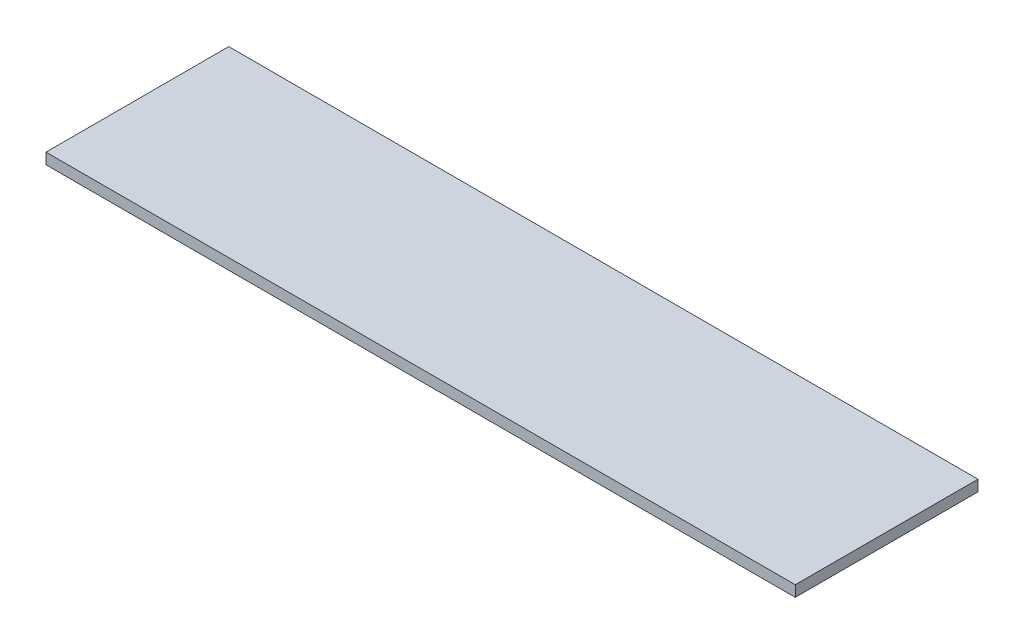
ISO-10303-21;
HEADER;
FILE_DESCRIPTION(('STEP AP214'),'2;1');
FILE_NAME('part.step','',(''),(''),'','','');
FILE_SCHEMA(('AUTOMOTIVE_DESIGN { 1 0 10303 214 1 1 1 1 }'));
ENDSEC;
DATA;
#1=APPLICATION_CONTEXT('core data for automotive mechanical design processes');
#2=APPLICATION_PROTOCOL_DEFINITION('international standard','automotive_design',2000,#1);
#3=PRODUCT_CONTEXT('',#1,'mechanical');
#4=PRODUCT('Part','Part','',(#3));
#5=PRODUCT_RELATED_PRODUCT_CATEGORY('part','',(#4));
#6=PRODUCT_DEFINITION_FORMATION('','',#4);
#7=PRODUCT_DEFINITION_CONTEXT('part definition',#1,'design');
#8=PRODUCT_DEFINITION('design','',#6,#7);
#9=PRODUCT_DEFINITION_SHAPE('','',#8);
#10=(LENGTH_UNIT() NAMED_UNIT(*) SI_UNIT(.MILLI.,.METRE.));
#11=(NAMED_UNIT(*) PLANE_ANGLE_UNIT() SI_UNIT($,.RADIAN.));
#12=(NAMED_UNIT(*) SI_UNIT($,.STERADIAN.) SOLID_ANGLE_UNIT());
#13=UNCERTAINTY_MEASURE_WITH_UNIT(LENGTH_MEASURE(1.E-05),#10,'distance_accuracy_value','');
#14=(GEOMETRIC_REPRESENTATION_CONTEXT(3) GLOBAL_UNCERTAINTY_ASSIGNED_CONTEXT((#13)) GLOBAL_UNIT_ASSIGNED_CONTEXT((#10,
#11,#12)) REPRESENTATION_CONTEXT('',''));
#15=CARTESIAN_POINT('',(0.,0.,0.));
#16=DIRECTION('',(0.,0.,1.));
#17=DIRECTION('',(1.,0.,0.));
#18=AXIS2_PLACEMENT_3D('',#15,#16,#17);
#19=CARTESIAN_POINT('',(0.,6.,0.));
#20=DIRECTION('',(0.,0.,-1.));
#21=DIRECTION('',(-1.,0.,0.));
#22=AXIS2_PLACEMENT_3D('',#19,#20,#21);
#23=PLANE('',#22);
#24=DIRECTION('',(1.,0.,0.));
#25=VECTOR('',#24,1.);
#26=CARTESIAN_POINT('',(0.,0.,0.));
#27=LINE('',#26,#25);
#28=CARTESIAN_POINT('',(-70.,0.,0.));
#29=VERTEX_POINT('',#28);
#30=CARTESIAN_POINT('',(340.,0.,0.));
#31=VERTEX_POINT('',#30);
#32=EDGE_CURVE('E84',#29,#31,#27,.T.);
#33=ORIENTED_EDGE('',*,*,#32,.T.);
#34=DIRECTION('',(0.,-1.,0.));
#35=VECTOR('',#34,1.);
#36=CARTESIAN_POINT('',(340.,6.,0.));
#37=LINE('',#36,#35);
#38=CARTESIAN_POINT('',(340.,6.,0.));
#39=VERTEX_POINT('',#38);
#40=EDGE_CURVE('E87',#39,#31,#37,.T.);
#41=ORIENTED_EDGE('',*,*,#40,.F.);
#42=DIRECTION('',(1.,0.,0.));
#43=VECTOR('',#42,1.);
#44=CARTESIAN_POINT('',(0.,6.,0.));
#45=LINE('',#44,#43);
#46=CARTESIAN_POINT('',(-70.,6.,0.));
#47=VERTEX_POINT('',#46);
#48=EDGE_CURVE('E54',#47,#39,#45,.T.);
#49=ORIENTED_EDGE('',*,*,#48,.F.);
#50=DIRECTION('',(0.,1.,0.));
#51=VECTOR('',#50,1.);
#52=CARTESIAN_POINT('',(-70.,6.,0.));
#53=LINE('',#52,#51);
#54=EDGE_CURVE('E88',#29,#47,#53,.T.);
#55=ORIENTED_EDGE('',*,*,#54,.F.);
#56=EDGE_LOOP('',(#33,#41,#49,#55));
#57=FACE_BOUND('',#56,.T.);
#58=ADVANCED_FACE('F45',(#57),#23,.F.);
#59=CARTESIAN_POINT('',(0.,6.,-100.));
#60=DIRECTION('',(0.,0.,1.));
#61=DIRECTION('',(1.,0.,0.));
#62=AXIS2_PLACEMENT_3D('',#59,#60,#61);
#63=PLANE('',#62);
#64=DIRECTION('',(-1.,0.,0.));
#65=VECTOR('',#64,1.);
#66=CARTESIAN_POINT('',(0.,0.,-100.));
#67=LINE('',#66,#65);
#68=CARTESIAN_POINT('',(340.,0.,-100.));
#69=VERTEX_POINT('',#68);
#70=CARTESIAN_POINT('',(-70.,0.,-100.));
#71=VERTEX_POINT('',#70);
#72=EDGE_CURVE('E48',#69,#71,#67,.T.);
#73=ORIENTED_EDGE('',*,*,#72,.T.);
#74=DIRECTION('',(0.,-1.,0.));
#75=VECTOR('',#74,1.);
#76=CARTESIAN_POINT('',(-70.,6.,-100.));
#77=LINE('',#76,#75);
#78=CARTESIAN_POINT('',(-70.,6.,-100.));
#79=VERTEX_POINT('',#78);
#80=EDGE_CURVE('E113',#79,#71,#77,.T.);
#81=ORIENTED_EDGE('',*,*,#80,.F.);
#82=DIRECTION('',(-1.,0.,0.));
#83=VECTOR('',#82,1.);
#84=CARTESIAN_POINT('',(0.,6.,-100.));
#85=LINE('',#84,#83);
#86=CARTESIAN_POINT('',(340.,6.,-100.));
#87=VERTEX_POINT('',#86);
#88=EDGE_CURVE('E11',#87,#79,#85,.T.);
#89=ORIENTED_EDGE('',*,*,#88,.F.);
#90=DIRECTION('',(0.,1.,0.));
#91=VECTOR('',#90,1.);
#92=CARTESIAN_POINT('',(340.,6.,-100.));
#93=LINE('',#92,#91);
#94=EDGE_CURVE('E101',#69,#87,#93,.T.);
#95=ORIENTED_EDGE('',*,*,#94,.F.);
#96=EDGE_LOOP('',(#73,#81,#89,#95));
#97=FACE_BOUND('',#96,.T.);
#98=ADVANCED_FACE('F128',(#97),#63,.F.);
#99=CARTESIAN_POINT('',(0.,6.,0.));
#100=DIRECTION('',(0.,-1.,0.));
#101=DIRECTION('',(0.,0.,-1.));
#102=AXIS2_PLACEMENT_3D('',#99,#100,#101);
#103=PLANE('',#102);
#104=ORIENTED_EDGE('',*,*,#88,.T.);
#105=DIRECTION('',(0.,0.,-1.));
#106=VECTOR('',#105,1.);
#107=CARTESIAN_POINT('',(-70.,6.,-100.));
#108=LINE('',#107,#106);
#109=EDGE_CURVE('E93',#47,#79,#108,.T.);
#110=ORIENTED_EDGE('',*,*,#109,.F.);
#111=ORIENTED_EDGE('',*,*,#48,.T.);
#112=DIRECTION('',(0.,0.,1.));
#113=VECTOR('',#112,1.);
#114=CARTESIAN_POINT('',(340.,6.,0.));
#115=LINE('',#114,#113);
#116=EDGE_CURVE('E105',#87,#39,#115,.T.);
#117=ORIENTED_EDGE('',*,*,#116,.F.);
#118=EDGE_LOOP('',(#104,#110,#111,#117));
#119=FACE_BOUND('',#118,.T.);
#120=ADVANCED_FACE('F131',(#119),#103,.F.);
#121=CARTESIAN_POINT('',(0.,0.,0.));
#122=DIRECTION('',(0.,-1.,0.));
#123=DIRECTION('',(0.,0.,-1.));
#124=AXIS2_PLACEMENT_3D('',#121,#122,#123);
#125=PLANE('',#124);
#126=ORIENTED_EDGE('',*,*,#32,.F.);
#127=DIRECTION('',(0.,0.,1.));
#128=VECTOR('',#127,1.);
#129=CARTESIAN_POINT('',(-70.,0.,-100.));
#130=LINE('',#129,#128);
#131=EDGE_CURVE('E117',#71,#29,#130,.T.);
#132=ORIENTED_EDGE('',*,*,#131,.F.);
#133=ORIENTED_EDGE('',*,*,#72,.F.);
#134=DIRECTION('',(0.,0.,-1.));
#135=VECTOR('',#134,1.);
#136=CARTESIAN_POINT('',(340.,0.,0.));
#137=LINE('',#136,#135);
#138=EDGE_CURVE('E95',#31,#69,#137,.T.);
#139=ORIENTED_EDGE('',*,*,#138,.F.);
#140=EDGE_LOOP('',(#126,#132,#133,#139));
#141=FACE_BOUND('',#140,.T.);
#142=ADVANCED_FACE('F96',(#141),#125,.T.);
#143=CARTESIAN_POINT('',(-70.,0.,0.));
#144=DIRECTION('',(-1.,0.,0.));
#145=DIRECTION('',(0.,0.,1.));
#146=AXIS2_PLACEMENT_3D('',#143,#144,#145);
#147=PLANE('',#146);
#148=ORIENTED_EDGE('',*,*,#80,.T.);
#149=ORIENTED_EDGE('',*,*,#131,.T.);
#150=ORIENTED_EDGE('',*,*,#54,.T.);
#151=ORIENTED_EDGE('',*,*,#109,.T.);
#152=EDGE_LOOP('',(#148,#149,#150,#151));
#153=FACE_BOUND('',#152,.T.);
#154=ADVANCED_FACE('F130',(#153),#147,.T.);
#155=CARTESIAN_POINT('',(340.,0.,0.));
#156=DIRECTION('',(1.,0.,0.));
#157=DIRECTION('',(0.,0.,-1.));
#158=AXIS2_PLACEMENT_3D('',#155,#156,#157);
#159=PLANE('',#158);
#160=ORIENTED_EDGE('',*,*,#40,.T.);
#161=ORIENTED_EDGE('',*,*,#138,.T.);
#162=ORIENTED_EDGE('',*,*,#94,.T.);
#163=ORIENTED_EDGE('',*,*,#116,.T.);
#164=EDGE_LOOP('',(#160,#161,#162,#163));
#165=FACE_BOUND('',#164,.T.);
#166=ADVANCED_FACE('F104',(#165),#159,.T.);
#167=CLOSED_SHELL('',(#58,#98,#120,#142,#154,#166));
#168=MANIFOLD_SOLID_BREP('B2',#167);
#169=ADVANCED_BREP_SHAPE_REPRESENTATION('',(#18,#168),#14);
#170=SHAPE_DEFINITION_REPRESENTATION(#9,#169);
ENDSEC;
END-ISO-10303-21;
